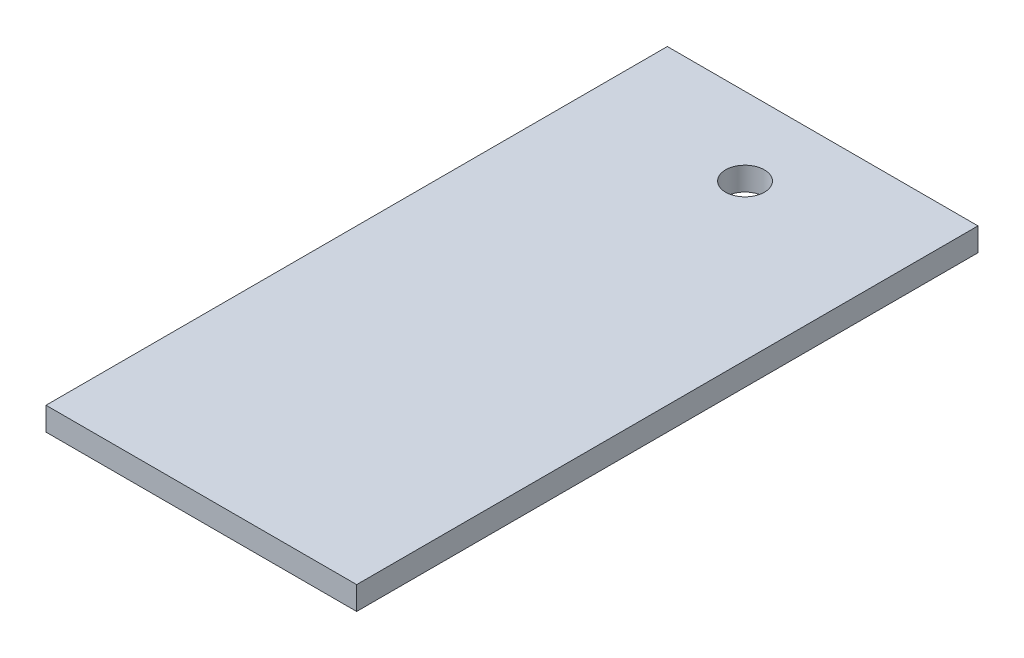
ISO-10303-21;
HEADER;
FILE_DESCRIPTION(('STEP AP214'),'2;1');
FILE_NAME('part.step','',(''),(''),'','','');
FILE_SCHEMA(('AUTOMOTIVE_DESIGN { 1 0 10303 214 1 1 1 1 }'));
ENDSEC;
DATA;
#1=APPLICATION_CONTEXT('core data for automotive mechanical design processes');
#2=APPLICATION_PROTOCOL_DEFINITION('international standard','automotive_design',2000,#1);
#3=PRODUCT_CONTEXT('',#1,'mechanical');
#4=PRODUCT('Part','Part','',(#3));
#5=PRODUCT_RELATED_PRODUCT_CATEGORY('part','',(#4));
#6=PRODUCT_DEFINITION_FORMATION('','',#4);
#7=PRODUCT_DEFINITION_CONTEXT('part definition',#1,'design');
#8=PRODUCT_DEFINITION('design','',#6,#7);
#9=PRODUCT_DEFINITION_SHAPE('','',#8);
#10=(LENGTH_UNIT() NAMED_UNIT(*) SI_UNIT(.MILLI.,.METRE.));
#11=(NAMED_UNIT(*) PLANE_ANGLE_UNIT() SI_UNIT($,.RADIAN.));
#12=(NAMED_UNIT(*) SI_UNIT($,.STERADIAN.) SOLID_ANGLE_UNIT());
#13=UNCERTAINTY_MEASURE_WITH_UNIT(LENGTH_MEASURE(1.E-05),#10,'distance_accuracy_value','');
#14=(GEOMETRIC_REPRESENTATION_CONTEXT(3) GLOBAL_UNCERTAINTY_ASSIGNED_CONTEXT((#13)) GLOBAL_UNIT_ASSIGNED_CONTEXT((#10,
#11,#12)) REPRESENTATION_CONTEXT('',''));
#15=CARTESIAN_POINT('',(0.,0.,0.));
#16=DIRECTION('',(0.,0.,1.));
#17=DIRECTION('',(1.,0.,0.));
#18=AXIS2_PLACEMENT_3D('',#15,#16,#17);
#19=CARTESIAN_POINT('',(20.,3.,40.));
#20=DIRECTION('',(-1.,0.,0.));
#21=DIRECTION('',(0.,0.,1.));
#22=AXIS2_PLACEMENT_3D('',#19,#20,#21);
#23=PLANE('',#22);
#24=DIRECTION('',(0.,0.,-1.));
#25=VECTOR('',#24,1.);
#26=CARTESIAN_POINT('',(20.,0.,40.));
#27=LINE('',#26,#25);
#28=CARTESIAN_POINT('',(20.,0.,40.));
#29=VERTEX_POINT('',#28);
#30=CARTESIAN_POINT('',(20.,0.,-40.));
#31=VERTEX_POINT('',#30);
#32=EDGE_CURVE('E98',#29,#31,#27,.T.);
#33=ORIENTED_EDGE('',*,*,#32,.T.);
#34=DIRECTION('',(0.,-1.,0.));
#35=VECTOR('',#34,1.);
#36=CARTESIAN_POINT('',(20.,3.,-40.));
#37=LINE('',#36,#35);
#38=CARTESIAN_POINT('',(20.,3.,-40.));
#39=VERTEX_POINT('',#38);
#40=EDGE_CURVE('E11',#39,#31,#37,.T.);
#41=ORIENTED_EDGE('',*,*,#40,.F.);
#42=DIRECTION('',(0.,0.,-1.));
#43=VECTOR('',#42,1.);
#44=CARTESIAN_POINT('',(20.,3.,40.));
#45=LINE('',#44,#43);
#46=CARTESIAN_POINT('',(20.,3.,40.));
#47=VERTEX_POINT('',#46);
#48=EDGE_CURVE('E85',#47,#39,#45,.T.);
#49=ORIENTED_EDGE('',*,*,#48,.F.);
#50=DIRECTION('',(0.,-1.,0.));
#51=VECTOR('',#50,1.);
#52=CARTESIAN_POINT('',(20.,3.,40.));
#53=LINE('',#52,#51);
#54=EDGE_CURVE('E94',#47,#29,#53,.T.);
#55=ORIENTED_EDGE('',*,*,#54,.T.);
#56=EDGE_LOOP('',(#33,#41,#49,#55));
#57=FACE_BOUND('',#56,.T.);
#58=ADVANCED_FACE('F33',(#57),#23,.F.);
#59=CARTESIAN_POINT('',(-20.,3.,-40.));
#60=DIRECTION('',(0.,0.,1.));
#61=DIRECTION('',(1.,0.,0.));
#62=AXIS2_PLACEMENT_3D('',#59,#60,#61);
#63=PLANE('',#62);
#64=DIRECTION('',(-1.,0.,0.));
#65=VECTOR('',#64,1.);
#66=CARTESIAN_POINT('',(-20.,0.,-40.));
#67=LINE('',#66,#65);
#68=CARTESIAN_POINT('',(-20.,0.,-40.));
#69=VERTEX_POINT('',#68);
#70=EDGE_CURVE('E89',#31,#69,#67,.T.);
#71=ORIENTED_EDGE('',*,*,#70,.T.);
#72=DIRECTION('',(0.,-1.,0.));
#73=VECTOR('',#72,1.);
#74=CARTESIAN_POINT('',(-20.,3.,-40.));
#75=LINE('',#74,#73);
#76=CARTESIAN_POINT('',(-20.,3.,-40.));
#77=VERTEX_POINT('',#76);
#78=EDGE_CURVE('E42',#77,#69,#75,.T.);
#79=ORIENTED_EDGE('',*,*,#78,.F.);
#80=DIRECTION('',(-1.,0.,0.));
#81=VECTOR('',#80,1.);
#82=CARTESIAN_POINT('',(-20.,3.,-40.));
#83=LINE('',#82,#81);
#84=EDGE_CURVE('E80',#39,#77,#83,.T.);
#85=ORIENTED_EDGE('',*,*,#84,.F.);
#86=ORIENTED_EDGE('',*,*,#40,.T.);
#87=EDGE_LOOP('',(#71,#79,#85,#86));
#88=FACE_BOUND('',#87,.T.);
#89=ADVANCED_FACE('F88',(#88),#63,.F.);
#90=CARTESIAN_POINT('',(-20.,3.,40.));
#91=DIRECTION('',(1.,0.,0.));
#92=DIRECTION('',(0.,0.,-1.));
#93=AXIS2_PLACEMENT_3D('',#90,#91,#92);
#94=PLANE('',#93);
#95=DIRECTION('',(0.,0.,1.));
#96=VECTOR('',#95,1.);
#97=CARTESIAN_POINT('',(-20.,0.,40.));
#98=LINE('',#97,#96);
#99=CARTESIAN_POINT('',(-20.,0.,40.));
#100=VERTEX_POINT('',#99);
#101=EDGE_CURVE('E67',#69,#100,#98,.T.);
#102=ORIENTED_EDGE('',*,*,#101,.T.);
#103=DIRECTION('',(0.,-1.,0.));
#104=VECTOR('',#103,1.);
#105=CARTESIAN_POINT('',(-20.,3.,40.));
#106=LINE('',#105,#104);
#107=CARTESIAN_POINT('',(-20.,3.,40.));
#108=VERTEX_POINT('',#107);
#109=EDGE_CURVE('E90',#108,#100,#106,.T.);
#110=ORIENTED_EDGE('',*,*,#109,.F.);
#111=DIRECTION('',(0.,0.,1.));
#112=VECTOR('',#111,1.);
#113=CARTESIAN_POINT('',(-20.,3.,40.));
#114=LINE('',#113,#112);
#115=EDGE_CURVE('E83',#77,#108,#114,.T.);
#116=ORIENTED_EDGE('',*,*,#115,.F.);
#117=ORIENTED_EDGE('',*,*,#78,.T.);
#118=EDGE_LOOP('',(#102,#110,#116,#117));
#119=FACE_BOUND('',#118,.T.);
#120=ADVANCED_FACE('F92',(#119),#94,.F.);
#121=CARTESIAN_POINT('',(-20.,3.,40.));
#122=DIRECTION('',(0.,0.,-1.));
#123=DIRECTION('',(-1.,0.,0.));
#124=AXIS2_PLACEMENT_3D('',#121,#122,#123);
#125=PLANE('',#124);
#126=DIRECTION('',(1.,0.,0.));
#127=VECTOR('',#126,1.);
#128=CARTESIAN_POINT('',(-20.,0.,40.));
#129=LINE('',#128,#127);
#130=EDGE_CURVE('E73',#100,#29,#129,.T.);
#131=ORIENTED_EDGE('',*,*,#130,.T.);
#132=ORIENTED_EDGE('',*,*,#54,.F.);
#133=DIRECTION('',(1.,0.,0.));
#134=VECTOR('',#133,1.);
#135=CARTESIAN_POINT('',(-20.,3.,40.));
#136=LINE('',#135,#134);
#137=EDGE_CURVE('E50',#108,#47,#136,.T.);
#138=ORIENTED_EDGE('',*,*,#137,.F.);
#139=ORIENTED_EDGE('',*,*,#109,.T.);
#140=EDGE_LOOP('',(#131,#132,#138,#139));
#141=FACE_BOUND('',#140,.T.);
#142=ADVANCED_FACE('F105',(#141),#125,.F.);
#143=CARTESIAN_POINT('',(0.,3.,0.));
#144=DIRECTION('',(0.,-1.,0.));
#145=DIRECTION('',(0.,0.,-1.));
#146=AXIS2_PLACEMENT_3D('',#143,#144,#145);
#147=PLANE('',#146);
#148=CARTESIAN_POINT('',(0.,3.,-30.));
#149=DIRECTION('',(0.,1.,0.));
#150=DIRECTION('',(0.,0.,1.));
#151=AXIS2_PLACEMENT_3D('',#148,#149,#150);
#152=CIRCLE('',#151,2.5);
#153=CARTESIAN_POINT('',(0.,3.,-27.5));
#154=VERTEX_POINT('',#153);
#155=EDGE_CURVE('E111',#154,#154,#152,.T.);
#156=ORIENTED_EDGE('',*,*,#155,.F.);
#157=EDGE_LOOP('',(#156));
#158=FACE_BOUND('',#157,.T.);
#159=ORIENTED_EDGE('',*,*,#48,.T.);
#160=ORIENTED_EDGE('',*,*,#84,.T.);
#161=ORIENTED_EDGE('',*,*,#115,.T.);
#162=ORIENTED_EDGE('',*,*,#137,.T.);
#163=EDGE_LOOP('',(#159,#160,#161,#162));
#164=FACE_BOUND('',#163,.T.);
#165=ADVANCED_FACE('F81',(#158,#164),#147,.F.);
#166=CARTESIAN_POINT('',(0.,0.,0.));
#167=DIRECTION('',(0.,-1.,0.));
#168=DIRECTION('',(0.,0.,-1.));
#169=AXIS2_PLACEMENT_3D('',#166,#167,#168);
#170=PLANE('',#169);
#171=CARTESIAN_POINT('',(0.,0.,-30.));
#172=DIRECTION('',(0.,-1.,0.));
#173=DIRECTION('',(0.,0.,-1.));
#174=AXIS2_PLACEMENT_3D('',#171,#172,#173);
#175=CIRCLE('',#174,2.5);
#176=CARTESIAN_POINT('',(0.,0.,-27.5));
#177=VERTEX_POINT('',#176);
#178=EDGE_CURVE('E36',#177,#177,#175,.T.);
#179=ORIENTED_EDGE('',*,*,#178,.F.);
#180=EDGE_LOOP('',(#179));
#181=FACE_BOUND('',#180,.T.);
#182=ORIENTED_EDGE('',*,*,#32,.F.);
#183=ORIENTED_EDGE('',*,*,#130,.F.);
#184=ORIENTED_EDGE('',*,*,#101,.F.);
#185=ORIENTED_EDGE('',*,*,#70,.F.);
#186=EDGE_LOOP('',(#182,#183,#184,#185));
#187=FACE_BOUND('',#186,.T.);
#188=ADVANCED_FACE('F108',(#181,#187),#170,.T.);
#189=CARTESIAN_POINT('',(0.,-11.,-30.));
#190=DIRECTION('',(0.,1.,0.));
#191=DIRECTION('',(0.,0.,1.));
#192=AXIS2_PLACEMENT_3D('',#189,#190,#191);
#193=CYLINDRICAL_SURFACE('',#192,2.5);
#194=CARTESIAN_POINT('',(0.,0.,-27.5));
#195=CARTESIAN_POINT('',(0.,0.0312500000000018,-27.5));
#196=CARTESIAN_POINT('',(0.,0.0625000000000018,-27.5));
#197=CARTESIAN_POINT('',(0.,0.125000000000002,-27.5));
#198=CARTESIAN_POINT('',(0.,0.156250000000002,-27.5));
#199=CARTESIAN_POINT('',(0.,0.218750000000002,-27.5));
#200=CARTESIAN_POINT('',(0.,0.250000000000002,-27.5));
#201=CARTESIAN_POINT('',(0.,0.312500000000002,-27.5));
#202=CARTESIAN_POINT('',(0.,0.343750000000002,-27.5));
#203=CARTESIAN_POINT('',(0.,0.406250000000002,-27.5));
#204=CARTESIAN_POINT('',(0.,0.437500000000002,-27.5));
#205=CARTESIAN_POINT('',(0.,0.500000000000002,-27.5));
#206=CARTESIAN_POINT('',(0.,0.531250000000002,-27.5));
#207=CARTESIAN_POINT('',(0.,0.593750000000002,-27.5));
#208=CARTESIAN_POINT('',(0.,0.625000000000002,-27.5));
#209=CARTESIAN_POINT('',(0.,0.687500000000002,-27.5));
#210=CARTESIAN_POINT('',(0.,0.718750000000002,-27.5));
#211=CARTESIAN_POINT('',(0.,0.781250000000002,-27.5));
#212=CARTESIAN_POINT('',(0.,0.812500000000001,-27.5));
#213=CARTESIAN_POINT('',(0.,0.875000000000001,-27.5));
#214=CARTESIAN_POINT('',(0.,0.906250000000001,-27.5));
#215=CARTESIAN_POINT('',(0.,0.968750000000001,-27.5));
#216=CARTESIAN_POINT('',(0.,1.,-27.5));
#217=CARTESIAN_POINT('',(0.,1.0625,-27.5));
#218=CARTESIAN_POINT('',(0.,1.09375,-27.5));
#219=CARTESIAN_POINT('',(0.,1.15625,-27.5));
#220=CARTESIAN_POINT('',(0.,1.1875,-27.5));
#221=CARTESIAN_POINT('',(0.,1.25,-27.5));
#222=CARTESIAN_POINT('',(0.,1.28125,-27.5));
#223=CARTESIAN_POINT('',(0.,1.34375,-27.5));
#224=CARTESIAN_POINT('',(0.,1.375,-27.5));
#225=CARTESIAN_POINT('',(0.,1.4375,-27.5));
#226=CARTESIAN_POINT('',(0.,1.46875,-27.5));
#227=CARTESIAN_POINT('',(0.,1.53125,-27.5));
#228=CARTESIAN_POINT('',(0.,1.5625,-27.5));
#229=CARTESIAN_POINT('',(0.,1.625,-27.5));
#230=CARTESIAN_POINT('',(0.,1.65625,-27.5));
#231=CARTESIAN_POINT('',(0.,1.71875,-27.5));
#232=CARTESIAN_POINT('',(0.,1.75,-27.5));
#233=CARTESIAN_POINT('',(0.,1.8125,-27.5));
#234=CARTESIAN_POINT('',(0.,1.84375,-27.5));
#235=CARTESIAN_POINT('',(0.,1.90625,-27.5));
#236=CARTESIAN_POINT('',(0.,1.9375,-27.5));
#237=CARTESIAN_POINT('',(0.,2.,-27.5));
#238=CARTESIAN_POINT('',(0.,2.03125,-27.5));
#239=CARTESIAN_POINT('',(0.,2.09375,-27.5));
#240=CARTESIAN_POINT('',(0.,2.125,-27.5));
#241=CARTESIAN_POINT('',(0.,2.1875,-27.5));
#242=CARTESIAN_POINT('',(0.,2.21875,-27.5));
#243=CARTESIAN_POINT('',(0.,2.28125,-27.5));
#244=CARTESIAN_POINT('',(0.,2.3125,-27.5));
#245=CARTESIAN_POINT('',(0.,2.375,-27.5));
#246=CARTESIAN_POINT('',(0.,2.40625,-27.5));
#247=CARTESIAN_POINT('',(0.,2.46875,-27.5));
#248=CARTESIAN_POINT('',(0.,2.5,-27.5));
#249=CARTESIAN_POINT('',(0.,2.5625,-27.5));
#250=CARTESIAN_POINT('',(0.,2.59375,-27.5));
#251=CARTESIAN_POINT('',(0.,2.65625,-27.5));
#252=CARTESIAN_POINT('',(0.,2.6875,-27.5));
#253=CARTESIAN_POINT('',(0.,2.75,-27.5));
#254=CARTESIAN_POINT('',(0.,2.78125,-27.5));
#255=CARTESIAN_POINT('',(0.,2.84375,-27.5));
#256=CARTESIAN_POINT('',(0.,2.875,-27.5));
#257=CARTESIAN_POINT('',(0.,2.9375,-27.5));
#258=CARTESIAN_POINT('',(0.,2.96875,-27.5));
#259=CARTESIAN_POINT('',(0.,3.,-27.5));
#260=B_SPLINE_CURVE_WITH_KNOTS('',3,(#194,#195,#196,#197,#198,#199,#200,#201,#202,#203,#204,
#205,#206,#207,#208,#209,#210,#211,#212,#213,#214,#215,#216,#217,#218,#219,#220,#221,#222,#223,
#224,#225,#226,#227,#228,#229,#230,#231,#232,#233,#234,#235,#236,#237,#238,#239,#240,#241,#242,
#243,#244,#245,#246,#247,#248,#249,#250,#251,#252,#253,#254,#255,#256,#257,#258,#259),
.UNSPECIFIED.,.F.,.F.,(4,2,2,2,2,2,2,2,2,2,2,2,2,2,2,2,2,2,2,2,2,2,2,2,2,2,2,2,2,2,2,2,4),(0.,
0.0937500000000001,0.1875,0.28125,0.375,0.46875,0.5625,0.656250000000001,0.750000000000001,
0.843749999999999,0.937499999999999,1.03125,1.125,1.21875,1.3125,1.40625,1.5,1.59375,1.6875,
1.78125,1.875,1.96875,2.0625,2.15625,2.25,2.34375,2.4375,2.53125,2.625,2.71875,2.8125,2.90625,
3.),.UNSPECIFIED.);
#261=EDGE_CURVE('BSEAM118',#177,#154,#260,.T.);
#262=ORIENTED_EDGE('',*,*,#178,.T.);
#263=ORIENTED_EDGE('',*,*,#155,.T.);
#264=ORIENTED_EDGE('',*,*,#261,.T.);
#265=ORIENTED_EDGE('',*,*,#261,.F.);
#266=EDGE_LOOP('',(#262,#264,#263,#265));
#267=FACE_BOUND('',#266,.T.);
#268=ADVANCED_FACE('F118',(#267),#193,.F.);
#269=CLOSED_SHELL('',(#58,#89,#120,#142,#165,#188,#268));
#270=MANIFOLD_SOLID_BREP('B2',#269);
#271=ADVANCED_BREP_SHAPE_REPRESENTATION('',(#18,#270),#14);
#272=SHAPE_DEFINITION_REPRESENTATION(#9,#271);
ENDSEC;
END-ISO-10303-21;
